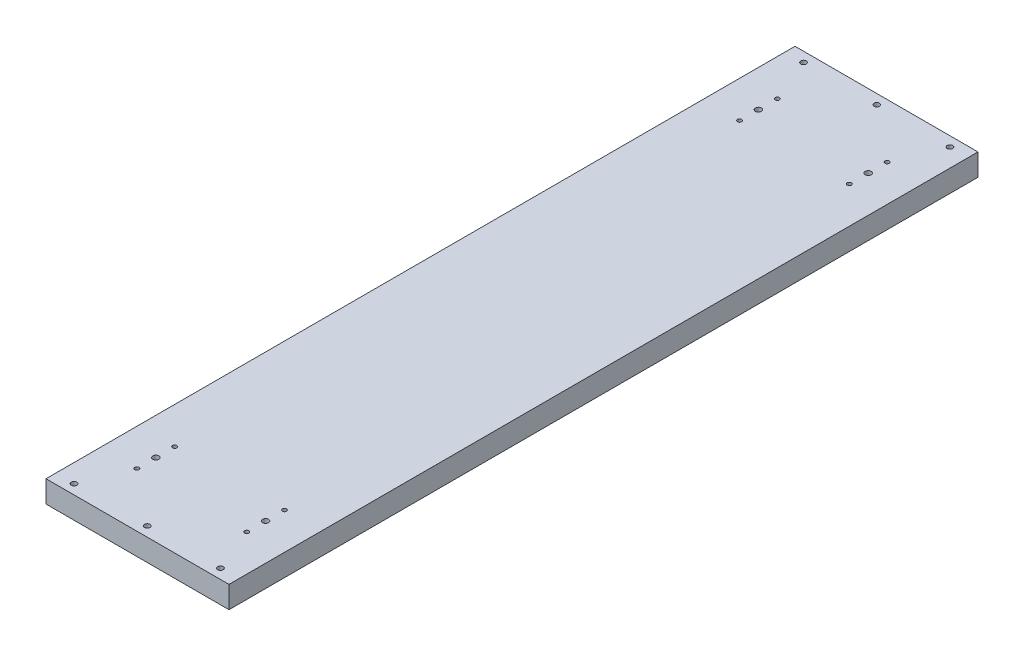
ISO-10303-21;
HEADER;
FILE_DESCRIPTION(('STEP AP214'),'2;1');
FILE_NAME('part.step','',(''),(''),'','','');
FILE_SCHEMA(('AUTOMOTIVE_DESIGN { 1 0 10303 214 1 1 1 1 }'));
ENDSEC;
DATA;
#1=APPLICATION_CONTEXT('core data for automotive mechanical design processes');
#2=APPLICATION_PROTOCOL_DEFINITION('international standard','automotive_design',2000,#1);
#3=PRODUCT_CONTEXT('',#1,'mechanical');
#4=PRODUCT('Part','Part','',(#3));
#5=PRODUCT_RELATED_PRODUCT_CATEGORY('part','',(#4));
#6=PRODUCT_DEFINITION_FORMATION('','',#4);
#7=PRODUCT_DEFINITION_CONTEXT('part definition',#1,'design');
#8=PRODUCT_DEFINITION('design','',#6,#7);
#9=PRODUCT_DEFINITION_SHAPE('','',#8);
#10=(LENGTH_UNIT() NAMED_UNIT(*) SI_UNIT(.MILLI.,.METRE.));
#11=(NAMED_UNIT(*) PLANE_ANGLE_UNIT() SI_UNIT($,.RADIAN.));
#12=(NAMED_UNIT(*) SI_UNIT($,.STERADIAN.) SOLID_ANGLE_UNIT());
#13=UNCERTAINTY_MEASURE_WITH_UNIT(LENGTH_MEASURE(1.E-05),#10,'distance_accuracy_value','');
#14=(GEOMETRIC_REPRESENTATION_CONTEXT(3) GLOBAL_UNCERTAINTY_ASSIGNED_CONTEXT((#13)) GLOBAL_UNIT_ASSIGNED_CONTEXT((#10,
#11,#12)) REPRESENTATION_CONTEXT('',''));
#15=CARTESIAN_POINT('',(0.,0.,0.));
#16=DIRECTION('',(0.,0.,1.));
#17=DIRECTION('',(1.,0.,0.));
#18=AXIS2_PLACEMENT_3D('',#15,#16,#17);
#19=CARTESIAN_POINT('',(-75.,9.,-307.));
#20=DIRECTION('',(0.,0.,-1.));
#21=DIRECTION('',(-1.,0.,0.));
#22=AXIS2_PLACEMENT_3D('',#19,#20,#21);
#23=PLANE('',#22);
#24=DIRECTION('',(1.,0.,0.));
#25=VECTOR('',#24,1.);
#26=CARTESIAN_POINT('',(-75.,-9.,-307.));
#27=LINE('',#26,#25);
#28=CARTESIAN_POINT('',(-75.,-9.,-307.));
#29=VERTEX_POINT('',#28);
#30=CARTESIAN_POINT('',(75.,-9.,-307.));
#31=VERTEX_POINT('',#30);
#32=EDGE_CURVE('E111',#29,#31,#27,.T.);
#33=ORIENTED_EDGE('',*,*,#32,.F.);
#34=DIRECTION('',(0.,-1.,0.));
#35=VECTOR('',#34,1.);
#36=CARTESIAN_POINT('',(-75.,9.,-307.));
#37=LINE('',#36,#35);
#38=CARTESIAN_POINT('',(-75.,9.,-307.));
#39=VERTEX_POINT('',#38);
#40=EDGE_CURVE('E11',#39,#29,#37,.T.);
#41=ORIENTED_EDGE('',*,*,#40,.F.);
#42=DIRECTION('',(1.,0.,0.));
#43=VECTOR('',#42,1.);
#44=CARTESIAN_POINT('',(-75.,9.,-307.));
#45=LINE('',#44,#43);
#46=CARTESIAN_POINT('',(75.,9.,-307.));
#47=VERTEX_POINT('',#46);
#48=EDGE_CURVE('E105',#39,#47,#45,.T.);
#49=ORIENTED_EDGE('',*,*,#48,.T.);
#50=DIRECTION('',(0.,-1.,0.));
#51=VECTOR('',#50,1.);
#52=CARTESIAN_POINT('',(75.,9.,-307.));
#53=LINE('',#52,#51);
#54=EDGE_CURVE('E48',#47,#31,#53,.T.);
#55=ORIENTED_EDGE('',*,*,#54,.T.);
#56=EDGE_LOOP('',(#33,#41,#49,#55));
#57=FACE_BOUND('',#56,.T.);
#58=ADVANCED_FACE('F45',(#57),#23,.T.);
#59=CARTESIAN_POINT('',(-75.,9.,-307.));
#60=DIRECTION('',(1.,0.,0.));
#61=DIRECTION('',(0.,0.,-1.));
#62=AXIS2_PLACEMENT_3D('',#59,#60,#61);
#63=PLANE('',#62);
#64=DIRECTION('',(0.,0.,1.));
#65=VECTOR('',#64,1.);
#66=CARTESIAN_POINT('',(-75.,-9.,-307.));
#67=LINE('',#66,#65);
#68=CARTESIAN_POINT('',(-75.,-9.,307.));
#69=VERTEX_POINT('',#68);
#70=EDGE_CURVE('E78',#29,#69,#67,.T.);
#71=ORIENTED_EDGE('',*,*,#70,.T.);
#72=DIRECTION('',(0.,-1.,0.));
#73=VECTOR('',#72,1.);
#74=CARTESIAN_POINT('',(-75.,9.,307.));
#75=LINE('',#74,#73);
#76=CARTESIAN_POINT('',(-75.,9.,307.));
#77=VERTEX_POINT('',#76);
#78=EDGE_CURVE('E54',#77,#69,#75,.T.);
#79=ORIENTED_EDGE('',*,*,#78,.F.);
#80=DIRECTION('',(0.,0.,1.));
#81=VECTOR('',#80,1.);
#82=CARTESIAN_POINT('',(-75.,9.,-307.));
#83=LINE('',#82,#81);
#84=EDGE_CURVE('E95',#39,#77,#83,.T.);
#85=ORIENTED_EDGE('',*,*,#84,.F.);
#86=ORIENTED_EDGE('',*,*,#40,.T.);
#87=EDGE_LOOP('',(#71,#79,#85,#86));
#88=FACE_BOUND('',#87,.T.);
#89=ADVANCED_FACE('F122',(#88),#63,.F.);
#90=CARTESIAN_POINT('',(-75.,9.,307.));
#91=DIRECTION('',(0.,0.,-1.));
#92=DIRECTION('',(-1.,0.,0.));
#93=AXIS2_PLACEMENT_3D('',#90,#91,#92);
#94=PLANE('',#93);
#95=DIRECTION('',(1.,0.,0.));
#96=VECTOR('',#95,1.);
#97=CARTESIAN_POINT('',(-75.,-9.,307.));
#98=LINE('',#97,#96);
#99=CARTESIAN_POINT('',(75.,-9.,307.));
#100=VERTEX_POINT('',#99);
#101=EDGE_CURVE('E102',#69,#100,#98,.T.);
#102=ORIENTED_EDGE('',*,*,#101,.T.);
#103=DIRECTION('',(0.,-1.,0.));
#104=VECTOR('',#103,1.);
#105=CARTESIAN_POINT('',(75.,9.,307.));
#106=LINE('',#105,#104);
#107=CARTESIAN_POINT('',(75.,9.,307.));
#108=VERTEX_POINT('',#107);
#109=EDGE_CURVE('E99',#108,#100,#106,.T.);
#110=ORIENTED_EDGE('',*,*,#109,.F.);
#111=DIRECTION('',(1.,0.,0.));
#112=VECTOR('',#111,1.);
#113=CARTESIAN_POINT('',(-75.,9.,307.));
#114=LINE('',#113,#112);
#115=EDGE_CURVE('E90',#77,#108,#114,.T.);
#116=ORIENTED_EDGE('',*,*,#115,.F.);
#117=ORIENTED_EDGE('',*,*,#78,.T.);
#118=EDGE_LOOP('',(#102,#110,#116,#117));
#119=FACE_BOUND('',#118,.T.);
#120=ADVANCED_FACE('F100',(#119),#94,.F.);
#121=CARTESIAN_POINT('',(75.,9.,-307.));
#122=DIRECTION('',(1.,0.,0.));
#123=DIRECTION('',(0.,0.,-1.));
#124=AXIS2_PLACEMENT_3D('',#121,#122,#123);
#125=PLANE('',#124);
#126=DIRECTION('',(0.,0.,1.));
#127=VECTOR('',#126,1.);
#128=CARTESIAN_POINT('',(75.,-9.,-307.));
#129=LINE('',#128,#127);
#130=EDGE_CURVE('E114',#31,#100,#129,.T.);
#131=ORIENTED_EDGE('',*,*,#130,.F.);
#132=ORIENTED_EDGE('',*,*,#54,.F.);
#133=DIRECTION('',(0.,0.,1.));
#134=VECTOR('',#133,1.);
#135=CARTESIAN_POINT('',(75.,9.,-307.));
#136=LINE('',#135,#134);
#137=EDGE_CURVE('E94',#47,#108,#136,.T.);
#138=ORIENTED_EDGE('',*,*,#137,.T.);
#139=ORIENTED_EDGE('',*,*,#109,.T.);
#140=EDGE_LOOP('',(#131,#132,#138,#139));
#141=FACE_BOUND('',#140,.T.);
#142=ADVANCED_FACE('F104',(#141),#125,.T.);
#143=CARTESIAN_POINT('',(0.,9.,0.));
#144=DIRECTION('',(0.,-1.,0.));
#145=DIRECTION('',(0.,0.,-1.));
#146=AXIS2_PLACEMENT_3D('',#143,#144,#145);
#147=PLANE('',#146);
#148=CARTESIAN_POINT('',(45.,9.,-247.));
#149=DIRECTION('',(0.,-1.,0.));
#150=DIRECTION('',(0.,0.,-1.));
#151=AXIS2_PLACEMENT_3D('',#148,#149,#150);
#152=CIRCLE('',#151,2.45744999999999);
#153=CARTESIAN_POINT('',(45.,9.,-249.45745));
#154=VERTEX_POINT('',#153);
#155=EDGE_CURVE('E245',#154,#154,#152,.T.);
#156=ORIENTED_EDGE('',*,*,#155,.T.);
#157=EDGE_LOOP('',(#156));
#158=FACE_BOUND('',#157,.T.);
#159=CARTESIAN_POINT('',(-45.,9.,-247.));
#160=DIRECTION('',(0.,-1.,0.));
#161=DIRECTION('',(0.,0.,-1.));
#162=AXIS2_PLACEMENT_3D('',#159,#160,#161);
#163=CIRCLE('',#162,2.45744999999999);
#164=CARTESIAN_POINT('',(-45.,9.,-249.45745));
#165=VERTEX_POINT('',#164);
#166=EDGE_CURVE('E255',#165,#165,#163,.T.);
#167=ORIENTED_EDGE('',*,*,#166,.T.);
#168=EDGE_LOOP('',(#167));
#169=FACE_BOUND('',#168,.T.);
#170=CARTESIAN_POINT('',(45.,9.,247.));
#171=DIRECTION('',(0.,-1.,0.));
#172=DIRECTION('',(0.,0.,-1.));
#173=AXIS2_PLACEMENT_3D('',#170,#171,#172);
#174=CIRCLE('',#173,2.45744999999999);
#175=CARTESIAN_POINT('',(45.,9.,244.54255));
#176=VERTEX_POINT('',#175);
#177=EDGE_CURVE('E261',#176,#176,#174,.T.);
#178=ORIENTED_EDGE('',*,*,#177,.T.);
#179=EDGE_LOOP('',(#178));
#180=FACE_BOUND('',#179,.T.);
#181=CARTESIAN_POINT('',(45.,9.,-262.5));
#182=DIRECTION('',(0.,-1.,0.));
#183=DIRECTION('',(0.,0.,-1.));
#184=AXIS2_PLACEMENT_3D('',#181,#182,#183);
#185=CIRCLE('',#184,1.7272);
#186=CARTESIAN_POINT('',(45.,9.,-264.2272));
#187=VERTEX_POINT('',#186);
#188=EDGE_CURVE('E267',#187,#187,#185,.T.);
#189=ORIENTED_EDGE('',*,*,#188,.T.);
#190=EDGE_LOOP('',(#189));
#191=FACE_BOUND('',#190,.T.);
#192=CARTESIAN_POINT('',(45.,9.,-231.5));
#193=DIRECTION('',(0.,-1.,0.));
#194=DIRECTION('',(0.,0.,-1.));
#195=AXIS2_PLACEMENT_3D('',#192,#193,#194);
#196=CIRCLE('',#195,1.7272);
#197=CARTESIAN_POINT('',(45.,9.,-233.2272));
#198=VERTEX_POINT('',#197);
#199=EDGE_CURVE('E273',#198,#198,#196,.T.);
#200=ORIENTED_EDGE('',*,*,#199,.T.);
#201=EDGE_LOOP('',(#200));
#202=FACE_BOUND('',#201,.T.);
#203=CARTESIAN_POINT('',(-45.,9.,-262.5));
#204=DIRECTION('',(0.,-1.,0.));
#205=DIRECTION('',(0.,0.,-1.));
#206=AXIS2_PLACEMENT_3D('',#203,#204,#205);
#207=CIRCLE('',#206,1.7272);
#208=CARTESIAN_POINT('',(-45.,9.,-264.2272));
#209=VERTEX_POINT('',#208);
#210=EDGE_CURVE('E279',#209,#209,#207,.T.);
#211=ORIENTED_EDGE('',*,*,#210,.T.);
#212=EDGE_LOOP('',(#211));
#213=FACE_BOUND('',#212,.T.);
#214=CARTESIAN_POINT('',(-45.,9.,-231.5));
#215=DIRECTION('',(0.,-1.,0.));
#216=DIRECTION('',(0.,0.,-1.));
#217=AXIS2_PLACEMENT_3D('',#214,#215,#216);
#218=CIRCLE('',#217,1.7272);
#219=CARTESIAN_POINT('',(-45.,9.,-233.2272));
#220=VERTEX_POINT('',#219);
#221=EDGE_CURVE('E285',#220,#220,#218,.T.);
#222=ORIENTED_EDGE('',*,*,#221,.T.);
#223=EDGE_LOOP('',(#222));
#224=FACE_BOUND('',#223,.T.);
#225=CARTESIAN_POINT('',(45.,9.,262.5));
#226=DIRECTION('',(0.,-1.,0.));
#227=DIRECTION('',(0.,0.,-1.));
#228=AXIS2_PLACEMENT_3D('',#225,#226,#227);
#229=CIRCLE('',#228,1.7272);
#230=CARTESIAN_POINT('',(45.,9.,260.7728));
#231=VERTEX_POINT('',#230);
#232=EDGE_CURVE('E291',#231,#231,#229,.T.);
#233=ORIENTED_EDGE('',*,*,#232,.T.);
#234=EDGE_LOOP('',(#233));
#235=FACE_BOUND('',#234,.T.);
#236=CARTESIAN_POINT('',(45.,9.,231.5));
#237=DIRECTION('',(0.,-1.,0.));
#238=DIRECTION('',(0.,0.,-1.));
#239=AXIS2_PLACEMENT_3D('',#236,#237,#238);
#240=CIRCLE('',#239,1.7272);
#241=CARTESIAN_POINT('',(45.,9.,229.7728));
#242=VERTEX_POINT('',#241);
#243=EDGE_CURVE('E297',#242,#242,#240,.T.);
#244=ORIENTED_EDGE('',*,*,#243,.T.);
#245=EDGE_LOOP('',(#244));
#246=FACE_BOUND('',#245,.T.);
#247=CARTESIAN_POINT('',(-45.,9.,247.));
#248=DIRECTION('',(0.,-1.,0.));
#249=DIRECTION('',(0.,0.,-1.));
#250=AXIS2_PLACEMENT_3D('',#247,#248,#249);
#251=CIRCLE('',#250,2.45744999999999);
#252=CARTESIAN_POINT('',(-45.,9.,244.54255));
#253=VERTEX_POINT('',#252);
#254=EDGE_CURVE('E303',#253,#253,#251,.T.);
#255=ORIENTED_EDGE('',*,*,#254,.T.);
#256=EDGE_LOOP('',(#255));
#257=FACE_BOUND('',#256,.T.);
#258=CARTESIAN_POINT('',(-45.,9.,262.5));
#259=DIRECTION('',(0.,-1.,0.));
#260=DIRECTION('',(0.,0.,-1.));
#261=AXIS2_PLACEMENT_3D('',#258,#259,#260);
#262=CIRCLE('',#261,1.7272);
#263=CARTESIAN_POINT('',(-45.,9.,260.7728));
#264=VERTEX_POINT('',#263);
#265=EDGE_CURVE('E309',#264,#264,#262,.T.);
#266=ORIENTED_EDGE('',*,*,#265,.T.);
#267=EDGE_LOOP('',(#266));
#268=FACE_BOUND('',#267,.T.);
#269=CARTESIAN_POINT('',(-45.,9.,231.5));
#270=DIRECTION('',(0.,-1.,0.));
#271=DIRECTION('',(0.,0.,-1.));
#272=AXIS2_PLACEMENT_3D('',#269,#270,#271);
#273=CIRCLE('',#272,1.7272);
#274=CARTESIAN_POINT('',(-45.,9.,229.7728));
#275=VERTEX_POINT('',#274);
#276=EDGE_CURVE('E315',#275,#275,#273,.T.);
#277=ORIENTED_EDGE('',*,*,#276,.T.);
#278=EDGE_LOOP('',(#277));
#279=FACE_BOUND('',#278,.T.);
#280=CARTESIAN_POINT('',(59.9999999999999,9.,-299.));
#281=DIRECTION('',(0.,-1.,0.));
#282=DIRECTION('',(0.,0.,-1.));
#283=AXIS2_PLACEMENT_3D('',#280,#281,#282);
#284=CIRCLE('',#283,2.2479);
#285=CARTESIAN_POINT('',(59.9999999999999,9.,-301.2479));
#286=VERTEX_POINT('',#285);
#287=EDGE_CURVE('E324',#286,#286,#284,.T.);
#288=ORIENTED_EDGE('',*,*,#287,.T.);
#289=EDGE_LOOP('',(#288));
#290=FACE_BOUND('',#289,.T.);
#291=CARTESIAN_POINT('',(0.,9.,-299.));
#292=DIRECTION('',(0.,-1.,0.));
#293=DIRECTION('',(0.,0.,-1.));
#294=AXIS2_PLACEMENT_3D('',#291,#292,#293);
#295=CIRCLE('',#294,2.24789999999999);
#296=CARTESIAN_POINT('',(0.,9.,-301.2479));
#297=VERTEX_POINT('',#296);
#298=EDGE_CURVE('E333',#297,#297,#295,.T.);
#299=ORIENTED_EDGE('',*,*,#298,.T.);
#300=EDGE_LOOP('',(#299));
#301=FACE_BOUND('',#300,.T.);
#302=CARTESIAN_POINT('',(-59.9999999999999,9.,-299.));
#303=DIRECTION('',(0.,-1.,0.));
#304=DIRECTION('',(0.,0.,-1.));
#305=AXIS2_PLACEMENT_3D('',#302,#303,#304);
#306=CIRCLE('',#305,2.2479);
#307=CARTESIAN_POINT('',(-59.9999999999999,9.,-301.2479));
#308=VERTEX_POINT('',#307);
#309=EDGE_CURVE('E342',#308,#308,#306,.T.);
#310=ORIENTED_EDGE('',*,*,#309,.T.);
#311=EDGE_LOOP('',(#310));
#312=FACE_BOUND('',#311,.T.);
#313=CARTESIAN_POINT('',(59.9999999999999,9.,299.));
#314=DIRECTION('',(0.,-1.,0.));
#315=DIRECTION('',(0.,0.,-1.));
#316=AXIS2_PLACEMENT_3D('',#313,#314,#315);
#317=CIRCLE('',#316,2.2479);
#318=CARTESIAN_POINT('',(59.9999999999999,9.,296.7521));
#319=VERTEX_POINT('',#318);
#320=EDGE_CURVE('E351',#319,#319,#317,.T.);
#321=ORIENTED_EDGE('',*,*,#320,.T.);
#322=EDGE_LOOP('',(#321));
#323=FACE_BOUND('',#322,.T.);
#324=CARTESIAN_POINT('',(0.,9.,299.));
#325=DIRECTION('',(0.,-1.,0.));
#326=DIRECTION('',(0.,0.,-1.));
#327=AXIS2_PLACEMENT_3D('',#324,#325,#326);
#328=CIRCLE('',#327,2.24789999999999);
#329=CARTESIAN_POINT('',(0.,9.,296.7521));
#330=VERTEX_POINT('',#329);
#331=EDGE_CURVE('E360',#330,#330,#328,.T.);
#332=ORIENTED_EDGE('',*,*,#331,.T.);
#333=EDGE_LOOP('',(#332));
#334=FACE_BOUND('',#333,.T.);
#335=CARTESIAN_POINT('',(-59.9999999999999,9.,299.));
#336=DIRECTION('',(0.,-1.,0.));
#337=DIRECTION('',(0.,0.,-1.));
#338=AXIS2_PLACEMENT_3D('',#335,#336,#337);
#339=CIRCLE('',#338,2.2479);
#340=CARTESIAN_POINT('',(-59.9999999999999,9.,296.7521));
#341=VERTEX_POINT('',#340);
#342=EDGE_CURVE('E115',#341,#341,#339,.T.);
#343=ORIENTED_EDGE('',*,*,#342,.T.);
#344=EDGE_LOOP('',(#343));
#345=FACE_BOUND('',#344,.T.);
#346=ORIENTED_EDGE('',*,*,#48,.F.);
#347=ORIENTED_EDGE('',*,*,#84,.T.);
#348=ORIENTED_EDGE('',*,*,#115,.T.);
#349=ORIENTED_EDGE('',*,*,#137,.F.);
#350=EDGE_LOOP('',(#346,#347,#348,#349));
#351=FACE_BOUND('',#350,.T.);
#352=ADVANCED_FACE('F93',(#158,#169,#180,#191,#202,#213,#224,#235,#246,#257,#268,#279,#290,#301,
#312,#323,#334,#345,#351),#147,.F.);
#353=CARTESIAN_POINT('',(0.,-9.,0.));
#354=DIRECTION('',(0.,-1.,0.));
#355=DIRECTION('',(0.,0.,-1.));
#356=AXIS2_PLACEMENT_3D('',#353,#354,#355);
#357=PLANE('',#356);
#358=CARTESIAN_POINT('',(45.,-9.,-247.));
#359=DIRECTION('',(0.,-1.,0.));
#360=DIRECTION('',(0.,0.,-1.));
#361=AXIS2_PLACEMENT_3D('',#358,#359,#360);
#362=CIRCLE('',#361,2.45745);
#363=CARTESIAN_POINT('',(45.,-9.,-249.45745));
#364=VERTEX_POINT('',#363);
#365=EDGE_CURVE('E248',#364,#364,#362,.T.);
#366=ORIENTED_EDGE('',*,*,#365,.F.);
#367=EDGE_LOOP('',(#366));
#368=FACE_BOUND('',#367,.T.);
#369=CARTESIAN_POINT('',(-45.,-9.,-247.));
#370=DIRECTION('',(0.,-1.,0.));
#371=DIRECTION('',(0.,0.,-1.));
#372=AXIS2_PLACEMENT_3D('',#369,#370,#371);
#373=CIRCLE('',#372,2.45745);
#374=CARTESIAN_POINT('',(-45.,-9.,-249.45745));
#375=VERTEX_POINT('',#374);
#376=EDGE_CURVE('E250',#375,#375,#373,.T.);
#377=ORIENTED_EDGE('',*,*,#376,.F.);
#378=EDGE_LOOP('',(#377));
#379=FACE_BOUND('',#378,.T.);
#380=CARTESIAN_POINT('',(45.,-9.,247.));
#381=DIRECTION('',(0.,-1.,0.));
#382=DIRECTION('',(0.,0.,-1.));
#383=AXIS2_PLACEMENT_3D('',#380,#381,#382);
#384=CIRCLE('',#383,2.45745);
#385=CARTESIAN_POINT('',(45.,-9.,244.54255));
#386=VERTEX_POINT('',#385);
#387=EDGE_CURVE('E258',#386,#386,#384,.T.);
#388=ORIENTED_EDGE('',*,*,#387,.F.);
#389=EDGE_LOOP('',(#388));
#390=FACE_BOUND('',#389,.T.);
#391=CARTESIAN_POINT('',(45.,-9.,-262.5));
#392=DIRECTION('',(0.,-1.,0.));
#393=DIRECTION('',(0.,0.,-1.));
#394=AXIS2_PLACEMENT_3D('',#391,#392,#393);
#395=CIRCLE('',#394,1.7272);
#396=CARTESIAN_POINT('',(45.,-9.,-264.2272));
#397=VERTEX_POINT('',#396);
#398=EDGE_CURVE('E264',#397,#397,#395,.T.);
#399=ORIENTED_EDGE('',*,*,#398,.F.);
#400=EDGE_LOOP('',(#399));
#401=FACE_BOUND('',#400,.T.);
#402=CARTESIAN_POINT('',(45.,-9.,-231.5));
#403=DIRECTION('',(0.,-1.,0.));
#404=DIRECTION('',(0.,0.,-1.));
#405=AXIS2_PLACEMENT_3D('',#402,#403,#404);
#406=CIRCLE('',#405,1.7272);
#407=CARTESIAN_POINT('',(45.,-9.,-233.2272));
#408=VERTEX_POINT('',#407);
#409=EDGE_CURVE('E270',#408,#408,#406,.T.);
#410=ORIENTED_EDGE('',*,*,#409,.F.);
#411=EDGE_LOOP('',(#410));
#412=FACE_BOUND('',#411,.T.);
#413=CARTESIAN_POINT('',(-45.,-9.,-262.5));
#414=DIRECTION('',(0.,-1.,0.));
#415=DIRECTION('',(0.,0.,-1.));
#416=AXIS2_PLACEMENT_3D('',#413,#414,#415);
#417=CIRCLE('',#416,1.7272);
#418=CARTESIAN_POINT('',(-45.,-9.,-264.2272));
#419=VERTEX_POINT('',#418);
#420=EDGE_CURVE('E276',#419,#419,#417,.T.);
#421=ORIENTED_EDGE('',*,*,#420,.F.);
#422=EDGE_LOOP('',(#421));
#423=FACE_BOUND('',#422,.T.);
#424=CARTESIAN_POINT('',(-45.,-9.,-231.5));
#425=DIRECTION('',(0.,-1.,0.));
#426=DIRECTION('',(0.,0.,-1.));
#427=AXIS2_PLACEMENT_3D('',#424,#425,#426);
#428=CIRCLE('',#427,1.7272);
#429=CARTESIAN_POINT('',(-45.,-9.,-233.2272));
#430=VERTEX_POINT('',#429);
#431=EDGE_CURVE('E282',#430,#430,#428,.T.);
#432=ORIENTED_EDGE('',*,*,#431,.F.);
#433=EDGE_LOOP('',(#432));
#434=FACE_BOUND('',#433,.T.);
#435=CARTESIAN_POINT('',(45.,-9.,262.5));
#436=DIRECTION('',(0.,-1.,0.));
#437=DIRECTION('',(0.,0.,-1.));
#438=AXIS2_PLACEMENT_3D('',#435,#436,#437);
#439=CIRCLE('',#438,1.7272);
#440=CARTESIAN_POINT('',(45.,-9.,260.7728));
#441=VERTEX_POINT('',#440);
#442=EDGE_CURVE('E288',#441,#441,#439,.T.);
#443=ORIENTED_EDGE('',*,*,#442,.F.);
#444=EDGE_LOOP('',(#443));
#445=FACE_BOUND('',#444,.T.);
#446=CARTESIAN_POINT('',(45.,-9.,231.5));
#447=DIRECTION('',(0.,-1.,0.));
#448=DIRECTION('',(0.,0.,-1.));
#449=AXIS2_PLACEMENT_3D('',#446,#447,#448);
#450=CIRCLE('',#449,1.7272);
#451=CARTESIAN_POINT('',(45.,-9.,229.7728));
#452=VERTEX_POINT('',#451);
#453=EDGE_CURVE('E294',#452,#452,#450,.T.);
#454=ORIENTED_EDGE('',*,*,#453,.F.);
#455=EDGE_LOOP('',(#454));
#456=FACE_BOUND('',#455,.T.);
#457=CARTESIAN_POINT('',(-45.,-9.,247.));
#458=DIRECTION('',(0.,-1.,0.));
#459=DIRECTION('',(0.,0.,-1.));
#460=AXIS2_PLACEMENT_3D('',#457,#458,#459);
#461=CIRCLE('',#460,2.45745);
#462=CARTESIAN_POINT('',(-45.,-9.,244.54255));
#463=VERTEX_POINT('',#462);
#464=EDGE_CURVE('E300',#463,#463,#461,.T.);
#465=ORIENTED_EDGE('',*,*,#464,.F.);
#466=EDGE_LOOP('',(#465));
#467=FACE_BOUND('',#466,.T.);
#468=CARTESIAN_POINT('',(-45.,-9.,262.5));
#469=DIRECTION('',(0.,-1.,0.));
#470=DIRECTION('',(0.,0.,-1.));
#471=AXIS2_PLACEMENT_3D('',#468,#469,#470);
#472=CIRCLE('',#471,1.7272);
#473=CARTESIAN_POINT('',(-45.,-9.,260.7728));
#474=VERTEX_POINT('',#473);
#475=EDGE_CURVE('E306',#474,#474,#472,.T.);
#476=ORIENTED_EDGE('',*,*,#475,.F.);
#477=EDGE_LOOP('',(#476));
#478=FACE_BOUND('',#477,.T.);
#479=CARTESIAN_POINT('',(-45.,-9.,231.5));
#480=DIRECTION('',(0.,-1.,0.));
#481=DIRECTION('',(0.,0.,-1.));
#482=AXIS2_PLACEMENT_3D('',#479,#480,#481);
#483=CIRCLE('',#482,1.7272);
#484=CARTESIAN_POINT('',(-45.,-9.,229.7728));
#485=VERTEX_POINT('',#484);
#486=EDGE_CURVE('E312',#485,#485,#483,.T.);
#487=ORIENTED_EDGE('',*,*,#486,.F.);
#488=EDGE_LOOP('',(#487));
#489=FACE_BOUND('',#488,.T.);
#490=CARTESIAN_POINT('',(59.9999999999999,-9.,-299.));
#491=DIRECTION('',(0.,-1.,0.));
#492=DIRECTION('',(0.,0.,-1.));
#493=AXIS2_PLACEMENT_3D('',#490,#491,#492);
#494=CIRCLE('',#493,4.21639999999999);
#495=CARTESIAN_POINT('',(59.9999999999999,-9.,-303.2164));
#496=VERTEX_POINT('',#495);
#497=EDGE_CURVE('E318',#496,#496,#494,.T.);
#498=ORIENTED_EDGE('',*,*,#497,.F.);
#499=EDGE_LOOP('',(#498));
#500=FACE_BOUND('',#499,.T.);
#501=CARTESIAN_POINT('',(0.,-9.,-299.));
#502=DIRECTION('',(0.,-1.,0.));
#503=DIRECTION('',(0.,0.,-1.));
#504=AXIS2_PLACEMENT_3D('',#501,#502,#503);
#505=CIRCLE('',#504,4.2164);
#506=CARTESIAN_POINT('',(0.,-9.,-303.2164));
#507=VERTEX_POINT('',#506);
#508=EDGE_CURVE('E327',#507,#507,#505,.T.);
#509=ORIENTED_EDGE('',*,*,#508,.F.);
#510=EDGE_LOOP('',(#509));
#511=FACE_BOUND('',#510,.T.);
#512=CARTESIAN_POINT('',(-59.9999999999999,-9.,-299.));
#513=DIRECTION('',(0.,-1.,0.));
#514=DIRECTION('',(0.,0.,-1.));
#515=AXIS2_PLACEMENT_3D('',#512,#513,#514);
#516=CIRCLE('',#515,4.2164);
#517=CARTESIAN_POINT('',(-59.9999999999999,-9.,-303.2164));
#518=VERTEX_POINT('',#517);
#519=EDGE_CURVE('E336',#518,#518,#516,.T.);
#520=ORIENTED_EDGE('',*,*,#519,.F.);
#521=EDGE_LOOP('',(#520));
#522=FACE_BOUND('',#521,.T.);
#523=CARTESIAN_POINT('',(59.9999999999999,-9.,299.));
#524=DIRECTION('',(0.,-1.,0.));
#525=DIRECTION('',(0.,0.,-1.));
#526=AXIS2_PLACEMENT_3D('',#523,#524,#525);
#527=CIRCLE('',#526,4.21639999999999);
#528=CARTESIAN_POINT('',(59.9999999999999,-9.,294.7836));
#529=VERTEX_POINT('',#528);
#530=EDGE_CURVE('E345',#529,#529,#527,.T.);
#531=ORIENTED_EDGE('',*,*,#530,.F.);
#532=EDGE_LOOP('',(#531));
#533=FACE_BOUND('',#532,.T.);
#534=CARTESIAN_POINT('',(0.,-9.,299.));
#535=DIRECTION('',(0.,-1.,0.));
#536=DIRECTION('',(0.,0.,-1.));
#537=AXIS2_PLACEMENT_3D('',#534,#535,#536);
#538=CIRCLE('',#537,4.2164);
#539=CARTESIAN_POINT('',(0.,-9.,294.7836));
#540=VERTEX_POINT('',#539);
#541=EDGE_CURVE('E354',#540,#540,#538,.T.);
#542=ORIENTED_EDGE('',*,*,#541,.F.);
#543=EDGE_LOOP('',(#542));
#544=FACE_BOUND('',#543,.T.);
#545=CARTESIAN_POINT('',(-59.9999999999999,-9.,299.));
#546=DIRECTION('',(0.,-1.,0.));
#547=DIRECTION('',(0.,0.,-1.));
#548=AXIS2_PLACEMENT_3D('',#545,#546,#547);
#549=CIRCLE('',#548,4.2164);
#550=CARTESIAN_POINT('',(-59.9999999999999,-9.,294.7836));
#551=VERTEX_POINT('',#550);
#552=EDGE_CURVE('E363',#551,#551,#549,.T.);
#553=ORIENTED_EDGE('',*,*,#552,.F.);
#554=EDGE_LOOP('',(#553));
#555=FACE_BOUND('',#554,.T.);
#556=ORIENTED_EDGE('',*,*,#32,.T.);
#557=ORIENTED_EDGE('',*,*,#130,.T.);
#558=ORIENTED_EDGE('',*,*,#101,.F.);
#559=ORIENTED_EDGE('',*,*,#70,.F.);
#560=EDGE_LOOP('',(#556,#557,#558,#559));
#561=FACE_BOUND('',#560,.T.);
#562=ADVANCED_FACE('F120',(#368,#379,#390,#401,#412,#423,#434,#445,#456,#467,#478,#489,#500,
#511,#522,#533,#544,#555,#561),#357,.T.);
#563=CARTESIAN_POINT('',(-59.9999999999999,-9.,299.));
#564=DIRECTION('',(0.,-1.,0.));
#565=DIRECTION('',(0.,0.,-1.));
#566=AXIS2_PLACEMENT_3D('',#563,#564,#565);
#567=CYLINDRICAL_SURFACE('',#566,2.24789999999999);
#568=ORIENTED_EDGE('',*,*,#342,.F.);
#569=EDGE_LOOP('',(#568));
#570=FACE_BOUND('',#569,.T.);
#571=CARTESIAN_POINT('',(-59.9999999999999,-7.34823237602753,299.));
#572=DIRECTION('',(0.,-1.,0.));
#573=DIRECTION('',(0.,0.,-1.));
#574=AXIS2_PLACEMENT_3D('',#571,#572,#573);
#575=CIRCLE('',#574,2.24789999999998);
#576=CARTESIAN_POINT('',(-59.9999999999999,-7.34823237602753,296.7521));
#577=VERTEX_POINT('',#576);
#578=EDGE_CURVE('E366',#577,#577,#575,.T.);
#579=ORIENTED_EDGE('',*,*,#578,.T.);
#580=EDGE_LOOP('',(#579));
#581=FACE_BOUND('',#580,.T.);
#582=ADVANCED_FACE('F144',(#570,#581),#567,.F.);
#583=CARTESIAN_POINT('',(-59.9999999999999,-9.,299.));
#584=DIRECTION('',(0.,-1.,0.));
#585=DIRECTION('',(0.,0.,-1.));
#586=AXIS2_PLACEMENT_3D('',#583,#584,#585);
#587=CONICAL_SURFACE('',#586,4.2164,0.872664625997171);
#588=ORIENTED_EDGE('',*,*,#578,.F.);
#589=EDGE_LOOP('',(#588));
#590=FACE_BOUND('',#589,.T.);
#591=ORIENTED_EDGE('',*,*,#552,.T.);
#592=EDGE_LOOP('',(#591));
#593=FACE_BOUND('',#592,.T.);
#594=ADVANCED_FACE('F150',(#590,#593),#587,.F.);
#595=CARTESIAN_POINT('',(0.,-9.,299.));
#596=DIRECTION('',(0.,-1.,0.));
#597=DIRECTION('',(0.,0.,-1.));
#598=AXIS2_PLACEMENT_3D('',#595,#596,#597);
#599=CYLINDRICAL_SURFACE('',#598,2.24789999999999);
#600=ORIENTED_EDGE('',*,*,#331,.F.);
#601=EDGE_LOOP('',(#600));
#602=FACE_BOUND('',#601,.T.);
#603=CARTESIAN_POINT('',(0.,-7.34823237602753,299.));
#604=DIRECTION('',(0.,-1.,0.));
#605=DIRECTION('',(0.,0.,-1.));
#606=AXIS2_PLACEMENT_3D('',#603,#604,#605);
#607=CIRCLE('',#606,2.24789999999999);
#608=CARTESIAN_POINT('',(0.,-7.34823237602753,296.7521));
#609=VERTEX_POINT('',#608);
#610=EDGE_CURVE('E357',#609,#609,#607,.T.);
#611=ORIENTED_EDGE('',*,*,#610,.T.);
#612=EDGE_LOOP('',(#611));
#613=FACE_BOUND('',#612,.T.);
#614=ADVANCED_FACE('F154',(#602,#613),#599,.F.);
#615=CARTESIAN_POINT('',(0.,-9.,299.));
#616=DIRECTION('',(0.,-1.,0.));
#617=DIRECTION('',(0.,0.,-1.));
#618=AXIS2_PLACEMENT_3D('',#615,#616,#617);
#619=CONICAL_SURFACE('',#618,4.2164,0.87266462599717);
#620=ORIENTED_EDGE('',*,*,#610,.F.);
#621=EDGE_LOOP('',(#620));
#622=FACE_BOUND('',#621,.T.);
#623=ORIENTED_EDGE('',*,*,#541,.T.);
#624=EDGE_LOOP('',(#623));
#625=FACE_BOUND('',#624,.T.);
#626=ADVANCED_FACE('F158',(#622,#625),#619,.F.);
#627=CARTESIAN_POINT('',(59.9999999999999,-9.,299.));
#628=DIRECTION('',(0.,-1.,0.));
#629=DIRECTION('',(0.,0.,-1.));
#630=AXIS2_PLACEMENT_3D('',#627,#628,#629);
#631=CYLINDRICAL_SURFACE('',#630,2.24789999999999);
#632=ORIENTED_EDGE('',*,*,#320,.F.);
#633=EDGE_LOOP('',(#632));
#634=FACE_BOUND('',#633,.T.);
#635=CARTESIAN_POINT('',(59.9999999999999,-7.34823237602753,299.));
#636=DIRECTION('',(0.,-1.,0.));
#637=DIRECTION('',(0.,0.,-1.));
#638=AXIS2_PLACEMENT_3D('',#635,#636,#637);
#639=CIRCLE('',#638,2.24789999999998);
#640=CARTESIAN_POINT('',(59.9999999999999,-7.34823237602753,296.7521));
#641=VERTEX_POINT('',#640);
#642=EDGE_CURVE('E348',#641,#641,#639,.T.);
#643=ORIENTED_EDGE('',*,*,#642,.T.);
#644=EDGE_LOOP('',(#643));
#645=FACE_BOUND('',#644,.T.);
#646=ADVANCED_FACE('F162',(#634,#645),#631,.F.);
#647=CARTESIAN_POINT('',(59.9999999999999,-9.,299.));
#648=DIRECTION('',(0.,-1.,0.));
#649=DIRECTION('',(0.,0.,-1.));
#650=AXIS2_PLACEMENT_3D('',#647,#648,#649);
#651=CONICAL_SURFACE('',#650,4.21639999999999,0.872664625997169);
#652=ORIENTED_EDGE('',*,*,#642,.F.);
#653=EDGE_LOOP('',(#652));
#654=FACE_BOUND('',#653,.T.);
#655=ORIENTED_EDGE('',*,*,#530,.T.);
#656=EDGE_LOOP('',(#655));
#657=FACE_BOUND('',#656,.T.);
#658=ADVANCED_FACE('F166',(#654,#657),#651,.F.);
#659=CARTESIAN_POINT('',(-59.9999999999999,-9.,-299.));
#660=DIRECTION('',(0.,-1.,0.));
#661=DIRECTION('',(0.,0.,-1.));
#662=AXIS2_PLACEMENT_3D('',#659,#660,#661);
#663=CYLINDRICAL_SURFACE('',#662,2.24789999999999);
#664=ORIENTED_EDGE('',*,*,#309,.F.);
#665=EDGE_LOOP('',(#664));
#666=FACE_BOUND('',#665,.T.);
#667=CARTESIAN_POINT('',(-59.9999999999999,-7.34823237602753,-299.));
#668=DIRECTION('',(0.,-1.,0.));
#669=DIRECTION('',(0.,0.,-1.));
#670=AXIS2_PLACEMENT_3D('',#667,#668,#669);
#671=CIRCLE('',#670,2.24789999999998);
#672=CARTESIAN_POINT('',(-59.9999999999999,-7.34823237602753,-301.2479));
#673=VERTEX_POINT('',#672);
#674=EDGE_CURVE('E339',#673,#673,#671,.T.);
#675=ORIENTED_EDGE('',*,*,#674,.T.);
#676=EDGE_LOOP('',(#675));
#677=FACE_BOUND('',#676,.T.);
#678=ADVANCED_FACE('F170',(#666,#677),#663,.F.);
#679=CARTESIAN_POINT('',(-59.9999999999999,-9.,-299.));
#680=DIRECTION('',(0.,-1.,0.));
#681=DIRECTION('',(0.,0.,-1.));
#682=AXIS2_PLACEMENT_3D('',#679,#680,#681);
#683=CONICAL_SURFACE('',#682,4.2164,0.872664625997171);
#684=ORIENTED_EDGE('',*,*,#674,.F.);
#685=EDGE_LOOP('',(#684));
#686=FACE_BOUND('',#685,.T.);
#687=ORIENTED_EDGE('',*,*,#519,.T.);
#688=EDGE_LOOP('',(#687));
#689=FACE_BOUND('',#688,.T.);
#690=ADVANCED_FACE('F174',(#686,#689),#683,.F.);
#691=CARTESIAN_POINT('',(0.,-9.,-299.));
#692=DIRECTION('',(0.,-1.,0.));
#693=DIRECTION('',(0.,0.,-1.));
#694=AXIS2_PLACEMENT_3D('',#691,#692,#693);
#695=CYLINDRICAL_SURFACE('',#694,2.24789999999999);
#696=ORIENTED_EDGE('',*,*,#298,.F.);
#697=EDGE_LOOP('',(#696));
#698=FACE_BOUND('',#697,.T.);
#699=CARTESIAN_POINT('',(0.,-7.34823237602753,-299.));
#700=DIRECTION('',(0.,-1.,0.));
#701=DIRECTION('',(0.,0.,-1.));
#702=AXIS2_PLACEMENT_3D('',#699,#700,#701);
#703=CIRCLE('',#702,2.24789999999999);
#704=CARTESIAN_POINT('',(0.,-7.34823237602753,-301.2479));
#705=VERTEX_POINT('',#704);
#706=EDGE_CURVE('E330',#705,#705,#703,.T.);
#707=ORIENTED_EDGE('',*,*,#706,.T.);
#708=EDGE_LOOP('',(#707));
#709=FACE_BOUND('',#708,.T.);
#710=ADVANCED_FACE('F178',(#698,#709),#695,.F.);
#711=CARTESIAN_POINT('',(0.,-9.,-299.));
#712=DIRECTION('',(0.,-1.,0.));
#713=DIRECTION('',(0.,0.,-1.));
#714=AXIS2_PLACEMENT_3D('',#711,#712,#713);
#715=CONICAL_SURFACE('',#714,4.2164,0.87266462599717);
#716=ORIENTED_EDGE('',*,*,#706,.F.);
#717=EDGE_LOOP('',(#716));
#718=FACE_BOUND('',#717,.T.);
#719=ORIENTED_EDGE('',*,*,#508,.T.);
#720=EDGE_LOOP('',(#719));
#721=FACE_BOUND('',#720,.T.);
#722=ADVANCED_FACE('F182',(#718,#721),#715,.F.);
#723=CARTESIAN_POINT('',(59.9999999999999,-9.,-299.));
#724=DIRECTION('',(0.,-1.,0.));
#725=DIRECTION('',(0.,0.,-1.));
#726=AXIS2_PLACEMENT_3D('',#723,#724,#725);
#727=CYLINDRICAL_SURFACE('',#726,2.24789999999999);
#728=ORIENTED_EDGE('',*,*,#287,.F.);
#729=EDGE_LOOP('',(#728));
#730=FACE_BOUND('',#729,.T.);
#731=CARTESIAN_POINT('',(59.9999999999999,-7.34823237602753,-299.));
#732=DIRECTION('',(0.,-1.,0.));
#733=DIRECTION('',(0.,0.,-1.));
#734=AXIS2_PLACEMENT_3D('',#731,#732,#733);
#735=CIRCLE('',#734,2.24789999999998);
#736=CARTESIAN_POINT('',(59.9999999999999,-7.34823237602753,-301.2479));
#737=VERTEX_POINT('',#736);
#738=EDGE_CURVE('E321',#737,#737,#735,.T.);
#739=ORIENTED_EDGE('',*,*,#738,.T.);
#740=EDGE_LOOP('',(#739));
#741=FACE_BOUND('',#740,.T.);
#742=ADVANCED_FACE('F186',(#730,#741),#727,.F.);
#743=CARTESIAN_POINT('',(59.9999999999999,-9.,-299.));
#744=DIRECTION('',(0.,-1.,0.));
#745=DIRECTION('',(0.,0.,-1.));
#746=AXIS2_PLACEMENT_3D('',#743,#744,#745);
#747=CONICAL_SURFACE('',#746,4.21639999999999,0.872664625997169);
#748=ORIENTED_EDGE('',*,*,#738,.F.);
#749=EDGE_LOOP('',(#748));
#750=FACE_BOUND('',#749,.T.);
#751=ORIENTED_EDGE('',*,*,#497,.T.);
#752=EDGE_LOOP('',(#751));
#753=FACE_BOUND('',#752,.T.);
#754=ADVANCED_FACE('F190',(#750,#753),#747,.F.);
#755=CARTESIAN_POINT('',(-45.,-9.,231.5));
#756=DIRECTION('',(0.,-1.,0.));
#757=DIRECTION('',(0.,0.,-1.));
#758=AXIS2_PLACEMENT_3D('',#755,#756,#757);
#759=CYLINDRICAL_SURFACE('',#758,1.7272);
#760=ORIENTED_EDGE('',*,*,#276,.F.);
#761=EDGE_LOOP('',(#760));
#762=FACE_BOUND('',#761,.T.);
#763=ORIENTED_EDGE('',*,*,#486,.T.);
#764=EDGE_LOOP('',(#763));
#765=FACE_BOUND('',#764,.T.);
#766=ADVANCED_FACE('F194',(#762,#765),#759,.F.);
#767=CARTESIAN_POINT('',(-45.,-9.,262.5));
#768=DIRECTION('',(0.,-1.,0.));
#769=DIRECTION('',(0.,0.,-1.));
#770=AXIS2_PLACEMENT_3D('',#767,#768,#769);
#771=CYLINDRICAL_SURFACE('',#770,1.7272);
#772=ORIENTED_EDGE('',*,*,#265,.F.);
#773=EDGE_LOOP('',(#772));
#774=FACE_BOUND('',#773,.T.);
#775=ORIENTED_EDGE('',*,*,#475,.T.);
#776=EDGE_LOOP('',(#775));
#777=FACE_BOUND('',#776,.T.);
#778=ADVANCED_FACE('F198',(#774,#777),#771,.F.);
#779=CARTESIAN_POINT('',(-45.,-9.,247.));
#780=DIRECTION('',(0.,-1.,0.));
#781=DIRECTION('',(0.,0.,-1.));
#782=AXIS2_PLACEMENT_3D('',#779,#780,#781);
#783=CYLINDRICAL_SURFACE('',#782,2.45745);
#784=ORIENTED_EDGE('',*,*,#254,.F.);
#785=EDGE_LOOP('',(#784));
#786=FACE_BOUND('',#785,.T.);
#787=ORIENTED_EDGE('',*,*,#464,.T.);
#788=EDGE_LOOP('',(#787));
#789=FACE_BOUND('',#788,.T.);
#790=ADVANCED_FACE('F202',(#786,#789),#783,.F.);
#791=CARTESIAN_POINT('',(45.,-9.,231.5));
#792=DIRECTION('',(0.,-1.,0.));
#793=DIRECTION('',(0.,0.,-1.));
#794=AXIS2_PLACEMENT_3D('',#791,#792,#793);
#795=CYLINDRICAL_SURFACE('',#794,1.7272);
#796=ORIENTED_EDGE('',*,*,#243,.F.);
#797=EDGE_LOOP('',(#796));
#798=FACE_BOUND('',#797,.T.);
#799=ORIENTED_EDGE('',*,*,#453,.T.);
#800=EDGE_LOOP('',(#799));
#801=FACE_BOUND('',#800,.T.);
#802=ADVANCED_FACE('F205',(#798,#801),#795,.F.);
#803=CARTESIAN_POINT('',(45.,-9.,262.5));
#804=DIRECTION('',(0.,-1.,0.));
#805=DIRECTION('',(0.,0.,-1.));
#806=AXIS2_PLACEMENT_3D('',#803,#804,#805);
#807=CYLINDRICAL_SURFACE('',#806,1.7272);
#808=ORIENTED_EDGE('',*,*,#232,.F.);
#809=EDGE_LOOP('',(#808));
#810=FACE_BOUND('',#809,.T.);
#811=ORIENTED_EDGE('',*,*,#442,.T.);
#812=EDGE_LOOP('',(#811));
#813=FACE_BOUND('',#812,.T.);
#814=ADVANCED_FACE('F209',(#810,#813),#807,.F.);
#815=CARTESIAN_POINT('',(-45.,-9.,-231.5));
#816=DIRECTION('',(0.,-1.,0.));
#817=DIRECTION('',(0.,0.,-1.));
#818=AXIS2_PLACEMENT_3D('',#815,#816,#817);
#819=CYLINDRICAL_SURFACE('',#818,1.7272);
#820=ORIENTED_EDGE('',*,*,#221,.F.);
#821=EDGE_LOOP('',(#820));
#822=FACE_BOUND('',#821,.T.);
#823=ORIENTED_EDGE('',*,*,#431,.T.);
#824=EDGE_LOOP('',(#823));
#825=FACE_BOUND('',#824,.T.);
#826=ADVANCED_FACE('F213',(#822,#825),#819,.F.);
#827=CARTESIAN_POINT('',(-45.,-9.,-262.5));
#828=DIRECTION('',(0.,-1.,0.));
#829=DIRECTION('',(0.,0.,-1.));
#830=AXIS2_PLACEMENT_3D('',#827,#828,#829);
#831=CYLINDRICAL_SURFACE('',#830,1.7272);
#832=ORIENTED_EDGE('',*,*,#210,.F.);
#833=EDGE_LOOP('',(#832));
#834=FACE_BOUND('',#833,.T.);
#835=ORIENTED_EDGE('',*,*,#420,.T.);
#836=EDGE_LOOP('',(#835));
#837=FACE_BOUND('',#836,.T.);
#838=ADVANCED_FACE('F217',(#834,#837),#831,.F.);
#839=CARTESIAN_POINT('',(45.,-9.,-231.5));
#840=DIRECTION('',(0.,-1.,0.));
#841=DIRECTION('',(0.,0.,-1.));
#842=AXIS2_PLACEMENT_3D('',#839,#840,#841);
#843=CYLINDRICAL_SURFACE('',#842,1.7272);
#844=ORIENTED_EDGE('',*,*,#199,.F.);
#845=EDGE_LOOP('',(#844));
#846=FACE_BOUND('',#845,.T.);
#847=ORIENTED_EDGE('',*,*,#409,.T.);
#848=EDGE_LOOP('',(#847));
#849=FACE_BOUND('',#848,.T.);
#850=ADVANCED_FACE('F221',(#846,#849),#843,.F.);
#851=CARTESIAN_POINT('',(45.,-9.,-262.5));
#852=DIRECTION('',(0.,-1.,0.));
#853=DIRECTION('',(0.,0.,-1.));
#854=AXIS2_PLACEMENT_3D('',#851,#852,#853);
#855=CYLINDRICAL_SURFACE('',#854,1.7272);
#856=ORIENTED_EDGE('',*,*,#188,.F.);
#857=EDGE_LOOP('',(#856));
#858=FACE_BOUND('',#857,.T.);
#859=ORIENTED_EDGE('',*,*,#398,.T.);
#860=EDGE_LOOP('',(#859));
#861=FACE_BOUND('',#860,.T.);
#862=ADVANCED_FACE('F225',(#858,#861),#855,.F.);
#863=CARTESIAN_POINT('',(45.,-9.,247.));
#864=DIRECTION('',(0.,-1.,0.));
#865=DIRECTION('',(0.,0.,-1.));
#866=AXIS2_PLACEMENT_3D('',#863,#864,#865);
#867=CYLINDRICAL_SURFACE('',#866,2.45745);
#868=ORIENTED_EDGE('',*,*,#177,.F.);
#869=EDGE_LOOP('',(#868));
#870=FACE_BOUND('',#869,.T.);
#871=ORIENTED_EDGE('',*,*,#387,.T.);
#872=EDGE_LOOP('',(#871));
#873=FACE_BOUND('',#872,.T.);
#874=ADVANCED_FACE('F229',(#870,#873),#867,.F.);
#875=CARTESIAN_POINT('',(-45.,-9.,-247.));
#876=DIRECTION('',(0.,-1.,0.));
#877=DIRECTION('',(0.,0.,-1.));
#878=AXIS2_PLACEMENT_3D('',#875,#876,#877);
#879=CYLINDRICAL_SURFACE('',#878,2.45745);
#880=ORIENTED_EDGE('',*,*,#166,.F.);
#881=EDGE_LOOP('',(#880));
#882=FACE_BOUND('',#881,.T.);
#883=ORIENTED_EDGE('',*,*,#376,.T.);
#884=EDGE_LOOP('',(#883));
#885=FACE_BOUND('',#884,.T.);
#886=ADVANCED_FACE('F233',(#882,#885),#879,.F.);
#887=CARTESIAN_POINT('',(45.,-9.,-247.));
#888=DIRECTION('',(0.,-1.,0.));
#889=DIRECTION('',(0.,0.,-1.));
#890=AXIS2_PLACEMENT_3D('',#887,#888,#889);
#891=CYLINDRICAL_SURFACE('',#890,2.45745);
#892=ORIENTED_EDGE('',*,*,#155,.F.);
#893=EDGE_LOOP('',(#892));
#894=FACE_BOUND('',#893,.T.);
#895=ORIENTED_EDGE('',*,*,#365,.T.);
#896=EDGE_LOOP('',(#895));
#897=FACE_BOUND('',#896,.T.);
#898=ADVANCED_FACE('F237',(#894,#897),#891,.F.);
#899=CLOSED_SHELL('',(#58,#89,#120,#142,#352,#562,#582,#594,#614,#626,#646,#658,#678,#690,#710,
#722,#742,#754,#766,#778,#790,#802,#814,#826,#838,#850,#862,#874,#886,#898));
#900=MANIFOLD_SOLID_BREP('B2',#899);
#901=ADVANCED_BREP_SHAPE_REPRESENTATION('',(#18,#900),#14);
#902=SHAPE_DEFINITION_REPRESENTATION(#9,#901);
ENDSEC;
END-ISO-10303-21;
